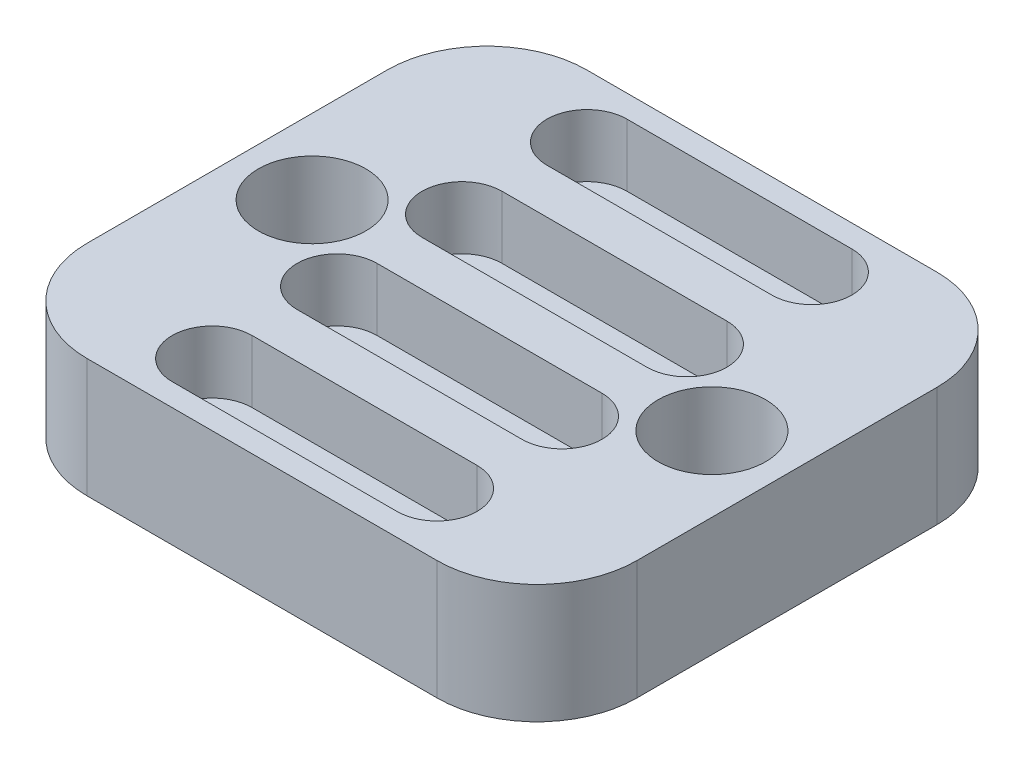
ISO-10303-21;
HEADER;
FILE_DESCRIPTION(('STEP AP214'),'2;1');
FILE_NAME('part.step','',(''),(''),'','','');
FILE_SCHEMA(('AUTOMOTIVE_DESIGN { 1 0 10303 214 1 1 1 1 }'));
ENDSEC;
DATA;
#1=APPLICATION_CONTEXT('core data for automotive mechanical design processes');
#2=APPLICATION_PROTOCOL_DEFINITION('international standard','automotive_design',2000,#1);
#3=PRODUCT_CONTEXT('',#1,'mechanical');
#4=PRODUCT('Part','Part','',(#3));
#5=PRODUCT_RELATED_PRODUCT_CATEGORY('part','',(#4));
#6=PRODUCT_DEFINITION_FORMATION('','',#4);
#7=PRODUCT_DEFINITION_CONTEXT('part definition',#1,'design');
#8=PRODUCT_DEFINITION('design','',#6,#7);
#9=PRODUCT_DEFINITION_SHAPE('','',#8);
#10=(LENGTH_UNIT() NAMED_UNIT(*) SI_UNIT(.MILLI.,.METRE.));
#11=(NAMED_UNIT(*) PLANE_ANGLE_UNIT() SI_UNIT($,.RADIAN.));
#12=(NAMED_UNIT(*) SI_UNIT($,.STERADIAN.) SOLID_ANGLE_UNIT());
#13=UNCERTAINTY_MEASURE_WITH_UNIT(LENGTH_MEASURE(1.E-05),#10,'distance_accuracy_value','');
#14=(GEOMETRIC_REPRESENTATION_CONTEXT(3) GLOBAL_UNCERTAINTY_ASSIGNED_CONTEXT((#13)) GLOBAL_UNIT_ASSIGNED_CONTEXT((#10,
#11,#12)) REPRESENTATION_CONTEXT('',''));
#15=CARTESIAN_POINT('',(0.,0.,0.));
#16=DIRECTION('',(0.,0.,1.));
#17=DIRECTION('',(1.,0.,0.));
#18=AXIS2_PLACEMENT_3D('',#15,#16,#17);
#19=CARTESIAN_POINT('',(4.5,0.,-19.1));
#20=DIRECTION('',(0.,0.,-1.));
#21=DIRECTION('',(-1.,0.,0.));
#22=AXIS2_PLACEMENT_3D('',#19,#20,#21);
#23=PLANE('',#22);
#24=DIRECTION('',(0.,-1.,0.));
#25=VECTOR('',#24,1.);
#26=CARTESIAN_POINT('',(-4.5,0.,-19.1));
#27=LINE('',#26,#25);
#28=CARTESIAN_POINT('',(-4.5,4.7625,-19.1));
#29=VERTEX_POINT('',#28);
#30=CARTESIAN_POINT('',(-4.5,2.2625,-19.1));
#31=VERTEX_POINT('',#30);
#32=EDGE_CURVE('E360',#29,#31,#27,.T.);
#33=ORIENTED_EDGE('',*,*,#32,.T.);
#34=DIRECTION('',(-1.,0.,0.));
#35=VECTOR('',#34,1.);
#36=CARTESIAN_POINT('',(4.5,2.2625,-19.1));
#37=LINE('',#36,#35);
#38=CARTESIAN_POINT('',(4.5,2.2625,-19.1));
#39=VERTEX_POINT('',#38);
#40=EDGE_CURVE('E287',#39,#31,#37,.T.);
#41=ORIENTED_EDGE('',*,*,#40,.F.);
#42=DIRECTION('',(0.,-1.,0.));
#43=VECTOR('',#42,1.);
#44=CARTESIAN_POINT('',(4.5,0.,-19.1));
#45=LINE('',#44,#43);
#46=CARTESIAN_POINT('',(4.5,4.7625,-19.1));
#47=VERTEX_POINT('',#46);
#48=EDGE_CURVE('E239',#47,#39,#45,.T.);
#49=ORIENTED_EDGE('',*,*,#48,.F.);
#50=DIRECTION('',(-1.,0.,0.));
#51=VECTOR('',#50,1.);
#52=CARTESIAN_POINT('',(4.5,4.7625,-19.1));
#53=LINE('',#52,#51);
#54=EDGE_CURVE('E290',#47,#29,#53,.T.);
#55=ORIENTED_EDGE('',*,*,#54,.T.);
#56=EDGE_LOOP('',(#33,#41,#49,#55));
#57=FACE_BOUND('',#56,.T.);
#58=ADVANCED_FACE('F35',(#57),#23,.F.);
#59=CARTESIAN_POINT('',(4.5,2.2625,0.));
#60=DIRECTION('',(0.,1.,0.));
#61=DIRECTION('',(0.,0.,1.));
#62=AXIS2_PLACEMENT_3D('',#59,#60,#61);
#63=PLANE('',#62);
#64=ORIENTED_EDGE('',*,*,#40,.T.);
#65=CARTESIAN_POINT('',(-4.5,2.2625,-17.5));
#66=DIRECTION('',(0.,1.,0.));
#67=DIRECTION('',(0.,0.,1.));
#68=AXIS2_PLACEMENT_3D('',#65,#66,#67);
#69=CIRCLE('',#68,1.6);
#70=CARTESIAN_POINT('',(-4.5,2.2625,-15.9));
#71=VERTEX_POINT('',#70);
#72=EDGE_CURVE('E385',#71,#31,#69,.F.);
#73=ORIENTED_EDGE('',*,*,#72,.F.);
#74=DIRECTION('',(-1.,0.,0.));
#75=VECTOR('',#74,1.);
#76=CARTESIAN_POINT('',(4.5,2.2625,-15.9));
#77=LINE('',#76,#75);
#78=CARTESIAN_POINT('',(4.5,2.2625,-15.9));
#79=VERTEX_POINT('',#78);
#80=EDGE_CURVE('E284',#79,#71,#77,.T.);
#81=ORIENTED_EDGE('',*,*,#80,.F.);
#82=CARTESIAN_POINT('',(4.5,2.2625,-17.5));
#83=DIRECTION('',(0.,1.,0.));
#84=DIRECTION('',(0.,0.,1.));
#85=AXIS2_PLACEMENT_3D('',#82,#83,#84);
#86=CIRCLE('',#85,1.6);
#87=EDGE_CURVE('E402',#39,#79,#86,.F.);
#88=ORIENTED_EDGE('',*,*,#87,.F.);
#89=EDGE_LOOP('',(#64,#73,#81,#88));
#90=FACE_BOUND('',#89,.T.);
#91=ADVANCED_FACE('F392',(#90),#63,.T.);
#92=CARTESIAN_POINT('',(4.5,0.,-15.9));
#93=DIRECTION('',(0.,0.,-1.));
#94=DIRECTION('',(-1.,0.,0.));
#95=AXIS2_PLACEMENT_3D('',#92,#93,#94);
#96=PLANE('',#95);
#97=DIRECTION('',(0.,-1.,0.));
#98=VECTOR('',#97,1.);
#99=CARTESIAN_POINT('',(-4.5,0.,-15.9));
#100=LINE('',#99,#98);
#101=CARTESIAN_POINT('',(-4.5,4.7625,-15.9));
#102=VERTEX_POINT('',#101);
#103=EDGE_CURVE('E229',#102,#71,#100,.T.);
#104=ORIENTED_EDGE('',*,*,#103,.F.);
#105=DIRECTION('',(-1.,0.,0.));
#106=VECTOR('',#105,1.);
#107=CARTESIAN_POINT('',(4.5,4.7625,-15.9));
#108=LINE('',#107,#106);
#109=CARTESIAN_POINT('',(4.5,4.7625,-15.9));
#110=VERTEX_POINT('',#109);
#111=EDGE_CURVE('E281',#110,#102,#108,.T.);
#112=ORIENTED_EDGE('',*,*,#111,.F.);
#113=DIRECTION('',(0.,-1.,0.));
#114=VECTOR('',#113,1.);
#115=CARTESIAN_POINT('',(4.5,0.,-15.9));
#116=LINE('',#115,#114);
#117=EDGE_CURVE('E364',#110,#79,#116,.T.);
#118=ORIENTED_EDGE('',*,*,#117,.T.);
#119=ORIENTED_EDGE('',*,*,#80,.T.);
#120=EDGE_LOOP('',(#104,#112,#118,#119));
#121=FACE_BOUND('',#120,.T.);
#122=ADVANCED_FACE('F397',(#121),#96,.T.);
#123=CARTESIAN_POINT('',(4.5,0.,-14.1));
#124=DIRECTION('',(0.,0.,-1.));
#125=DIRECTION('',(-1.,0.,0.));
#126=AXIS2_PLACEMENT_3D('',#123,#124,#125);
#127=PLANE('',#126);
#128=DIRECTION('',(0.,-1.,0.));
#129=VECTOR('',#128,1.);
#130=CARTESIAN_POINT('',(-4.5,0.,-14.1));
#131=LINE('',#130,#129);
#132=CARTESIAN_POINT('',(-4.5,4.7625,-14.1));
#133=VERTEX_POINT('',#132);
#134=CARTESIAN_POINT('',(-4.5,2.2625,-14.1));
#135=VERTEX_POINT('',#134);
#136=EDGE_CURVE('E203',#133,#135,#131,.T.);
#137=ORIENTED_EDGE('',*,*,#136,.T.);
#138=DIRECTION('',(-1.,0.,0.));
#139=VECTOR('',#138,1.);
#140=CARTESIAN_POINT('',(4.5,2.2625,-14.1));
#141=LINE('',#140,#139);
#142=CARTESIAN_POINT('',(4.5,2.2625,-14.1));
#143=VERTEX_POINT('',#142);
#144=EDGE_CURVE('E276',#143,#135,#141,.T.);
#145=ORIENTED_EDGE('',*,*,#144,.F.);
#146=DIRECTION('',(0.,-1.,0.));
#147=VECTOR('',#146,1.);
#148=CARTESIAN_POINT('',(4.5,0.,-14.1));
#149=LINE('',#148,#147);
#150=CARTESIAN_POINT('',(4.5,4.7625,-14.1));
#151=VERTEX_POINT('',#150);
#152=EDGE_CURVE('E367',#151,#143,#149,.T.);
#153=ORIENTED_EDGE('',*,*,#152,.F.);
#154=DIRECTION('',(-1.,0.,0.));
#155=VECTOR('',#154,1.);
#156=CARTESIAN_POINT('',(4.5,4.7625,-14.1));
#157=LINE('',#156,#155);
#158=EDGE_CURVE('E279',#151,#133,#157,.T.);
#159=ORIENTED_EDGE('',*,*,#158,.T.);
#160=EDGE_LOOP('',(#137,#145,#153,#159));
#161=FACE_BOUND('',#160,.T.);
#162=ADVANCED_FACE('F432',(#161),#127,.F.);
#163=CARTESIAN_POINT('',(4.5,2.2625,0.));
#164=DIRECTION('',(0.,1.,0.));
#165=DIRECTION('',(0.,0.,1.));
#166=AXIS2_PLACEMENT_3D('',#163,#164,#165);
#167=PLANE('',#166);
#168=ORIENTED_EDGE('',*,*,#144,.T.);
#169=CARTESIAN_POINT('',(-4.5,2.2625,-12.5));
#170=DIRECTION('',(0.,1.,0.));
#171=DIRECTION('',(0.,0.,1.));
#172=AXIS2_PLACEMENT_3D('',#169,#170,#171);
#173=CIRCLE('',#172,1.6);
#174=CARTESIAN_POINT('',(-4.5,2.2625,-10.9));
#175=VERTEX_POINT('',#174);
#176=EDGE_CURVE('E207',#175,#135,#173,.F.);
#177=ORIENTED_EDGE('',*,*,#176,.F.);
#178=DIRECTION('',(-1.,0.,0.));
#179=VECTOR('',#178,1.);
#180=CARTESIAN_POINT('',(4.5,2.2625,-10.9));
#181=LINE('',#180,#179);
#182=CARTESIAN_POINT('',(4.5,2.2625,-10.9));
#183=VERTEX_POINT('',#182);
#184=EDGE_CURVE('E218',#183,#175,#181,.T.);
#185=ORIENTED_EDGE('',*,*,#184,.F.);
#186=CARTESIAN_POINT('',(4.5,2.2625,-12.5));
#187=DIRECTION('',(0.,1.,0.));
#188=DIRECTION('',(0.,0.,1.));
#189=AXIS2_PLACEMENT_3D('',#186,#187,#188);
#190=CIRCLE('',#189,1.6);
#191=EDGE_CURVE('E420',#143,#183,#190,.F.);
#192=ORIENTED_EDGE('',*,*,#191,.F.);
#193=EDGE_LOOP('',(#168,#177,#185,#192));
#194=FACE_BOUND('',#193,.T.);
#195=ADVANCED_FACE('F434',(#194),#167,.T.);
#196=CARTESIAN_POINT('',(4.5,0.,-10.9));
#197=DIRECTION('',(0.,0.,-1.));
#198=DIRECTION('',(-1.,0.,0.));
#199=AXIS2_PLACEMENT_3D('',#196,#197,#198);
#200=PLANE('',#199);
#201=DIRECTION('',(0.,-1.,0.));
#202=VECTOR('',#201,1.);
#203=CARTESIAN_POINT('',(-4.5,0.,-10.9));
#204=LINE('',#203,#202);
#205=CARTESIAN_POINT('',(-4.5,4.7625,-10.9));
#206=VERTEX_POINT('',#205);
#207=EDGE_CURVE('E200',#206,#175,#204,.T.);
#208=ORIENTED_EDGE('',*,*,#207,.F.);
#209=DIRECTION('',(-1.,0.,0.));
#210=VECTOR('',#209,1.);
#211=CARTESIAN_POINT('',(4.5,4.7625,-10.9));
#212=LINE('',#211,#210);
#213=CARTESIAN_POINT('',(4.5,4.7625,-10.9));
#214=VERTEX_POINT('',#213);
#215=EDGE_CURVE('E212',#214,#206,#212,.T.);
#216=ORIENTED_EDGE('',*,*,#215,.F.);
#217=DIRECTION('',(0.,-1.,0.));
#218=VECTOR('',#217,1.);
#219=CARTESIAN_POINT('',(4.5,0.,-10.9));
#220=LINE('',#219,#218);
#221=EDGE_CURVE('E369',#214,#183,#220,.T.);
#222=ORIENTED_EDGE('',*,*,#221,.T.);
#223=ORIENTED_EDGE('',*,*,#184,.T.);
#224=EDGE_LOOP('',(#208,#216,#222,#223));
#225=FACE_BOUND('',#224,.T.);
#226=ADVANCED_FACE('F222',(#225),#200,.T.);
#227=CARTESIAN_POINT('',(4.5,0.,-9.1));
#228=DIRECTION('',(0.,0.,-1.));
#229=DIRECTION('',(-1.,0.,0.));
#230=AXIS2_PLACEMENT_3D('',#227,#228,#229);
#231=PLANE('',#230);
#232=DIRECTION('',(0.,-1.,0.));
#233=VECTOR('',#232,1.);
#234=CARTESIAN_POINT('',(-4.5,0.,-9.1));
#235=LINE('',#234,#233);
#236=CARTESIAN_POINT('',(-4.5,4.7625,-9.1));
#237=VERTEX_POINT('',#236);
#238=CARTESIAN_POINT('',(-4.5,2.2625,-9.1));
#239=VERTEX_POINT('',#238);
#240=EDGE_CURVE('E224',#237,#239,#235,.T.);
#241=ORIENTED_EDGE('',*,*,#240,.T.);
#242=DIRECTION('',(-1.,0.,0.));
#243=VECTOR('',#242,1.);
#244=CARTESIAN_POINT('',(4.5,2.2625,-9.1));
#245=LINE('',#244,#243);
#246=CARTESIAN_POINT('',(4.5,2.2625,-9.1));
#247=VERTEX_POINT('',#246);
#248=EDGE_CURVE('E270',#247,#239,#245,.T.);
#249=ORIENTED_EDGE('',*,*,#248,.F.);
#250=DIRECTION('',(0.,-1.,0.));
#251=VECTOR('',#250,1.);
#252=CARTESIAN_POINT('',(4.5,0.,-9.1));
#253=LINE('',#252,#251);
#254=CARTESIAN_POINT('',(4.5,4.7625,-9.1));
#255=VERTEX_POINT('',#254);
#256=EDGE_CURVE('E371',#255,#247,#253,.T.);
#257=ORIENTED_EDGE('',*,*,#256,.F.);
#258=DIRECTION('',(-1.,0.,0.));
#259=VECTOR('',#258,1.);
#260=CARTESIAN_POINT('',(4.5,4.7625,-9.1));
#261=LINE('',#260,#259);
#262=EDGE_CURVE('E219',#255,#237,#261,.T.);
#263=ORIENTED_EDGE('',*,*,#262,.T.);
#264=EDGE_LOOP('',(#241,#249,#257,#263));
#265=FACE_BOUND('',#264,.T.);
#266=ADVANCED_FACE('F534',(#265),#231,.F.);
#267=CARTESIAN_POINT('',(4.5,2.2625,0.));
#268=DIRECTION('',(0.,1.,0.));
#269=DIRECTION('',(0.,0.,1.));
#270=AXIS2_PLACEMENT_3D('',#267,#268,#269);
#271=PLANE('',#270);
#272=ORIENTED_EDGE('',*,*,#248,.T.);
#273=CARTESIAN_POINT('',(-4.5,2.2625,-7.5));
#274=DIRECTION('',(0.,1.,0.));
#275=DIRECTION('',(0.,0.,1.));
#276=AXIS2_PLACEMENT_3D('',#273,#274,#275);
#277=CIRCLE('',#276,1.6);
#278=CARTESIAN_POINT('',(-4.5,2.2625,-5.9));
#279=VERTEX_POINT('',#278);
#280=EDGE_CURVE('E208',#279,#239,#277,.F.);
#281=ORIENTED_EDGE('',*,*,#280,.F.);
#282=DIRECTION('',(-1.,0.,0.));
#283=VECTOR('',#282,1.);
#284=CARTESIAN_POINT('',(4.5,2.2625,-5.9));
#285=LINE('',#284,#283);
#286=CARTESIAN_POINT('',(4.5,2.2625,-5.9));
#287=VERTEX_POINT('',#286);
#288=EDGE_CURVE('E267',#287,#279,#285,.T.);
#289=ORIENTED_EDGE('',*,*,#288,.F.);
#290=CARTESIAN_POINT('',(4.5,2.2625,-7.5));
#291=DIRECTION('',(0.,1.,0.));
#292=DIRECTION('',(0.,0.,1.));
#293=AXIS2_PLACEMENT_3D('',#290,#291,#292);
#294=CIRCLE('',#293,1.6);
#295=EDGE_CURVE('E412',#247,#287,#294,.F.);
#296=ORIENTED_EDGE('',*,*,#295,.F.);
#297=EDGE_LOOP('',(#272,#281,#289,#296));
#298=FACE_BOUND('',#297,.T.);
#299=ADVANCED_FACE('F530',(#298),#271,.T.);
#300=CARTESIAN_POINT('',(4.5,0.,-5.9));
#301=DIRECTION('',(0.,0.,-1.));
#302=DIRECTION('',(0.,1.,0.));
#303=AXIS2_PLACEMENT_3D('',#300,#301,#302);
#304=PLANE('',#303);
#305=DIRECTION('',(0.,-1.,0.));
#306=VECTOR('',#305,1.);
#307=CARTESIAN_POINT('',(-4.5,0.,-5.9));
#308=LINE('',#307,#306);
#309=CARTESIAN_POINT('',(-4.5,4.7625,-5.9));
#310=VERTEX_POINT('',#309);
#311=EDGE_CURVE('E227',#310,#279,#308,.T.);
#312=ORIENTED_EDGE('',*,*,#311,.F.);
#313=DIRECTION('',(-1.,0.,0.));
#314=VECTOR('',#313,1.);
#315=CARTESIAN_POINT('',(4.5,4.7625,-5.9));
#316=LINE('',#315,#314);
#317=CARTESIAN_POINT('',(4.5,4.7625,-5.9));
#318=VERTEX_POINT('',#317);
#319=EDGE_CURVE('E264',#318,#310,#316,.T.);
#320=ORIENTED_EDGE('',*,*,#319,.F.);
#321=DIRECTION('',(0.,-1.,0.));
#322=VECTOR('',#321,1.);
#323=CARTESIAN_POINT('',(4.5,0.,-5.9));
#324=LINE('',#323,#322);
#325=EDGE_CURVE('E373',#318,#287,#324,.T.);
#326=ORIENTED_EDGE('',*,*,#325,.T.);
#327=ORIENTED_EDGE('',*,*,#288,.T.);
#328=EDGE_LOOP('',(#312,#320,#326,#327));
#329=FACE_BOUND('',#328,.T.);
#330=ADVANCED_FACE('F527',(#329),#304,.T.);
#331=CARTESIAN_POINT('',(4.5,0.,-4.1));
#332=DIRECTION('',(0.,0.,-1.));
#333=DIRECTION('',(0.,1.,0.));
#334=AXIS2_PLACEMENT_3D('',#331,#332,#333);
#335=PLANE('',#334);
#336=DIRECTION('',(0.,-1.,0.));
#337=VECTOR('',#336,1.);
#338=CARTESIAN_POINT('',(-4.5,0.,-4.1));
#339=LINE('',#338,#337);
#340=CARTESIAN_POINT('',(-4.5,4.7625,-4.1));
#341=VERTEX_POINT('',#340);
#342=CARTESIAN_POINT('',(-4.5,2.2625,-4.1));
#343=VERTEX_POINT('',#342);
#344=EDGE_CURVE('E234',#341,#343,#339,.T.);
#345=ORIENTED_EDGE('',*,*,#344,.T.);
#346=DIRECTION('',(-1.,0.,0.));
#347=VECTOR('',#346,1.);
#348=CARTESIAN_POINT('',(4.5,2.2625,-4.1));
#349=LINE('',#348,#347);
#350=CARTESIAN_POINT('',(4.5,2.2625,-4.1));
#351=VERTEX_POINT('',#350);
#352=EDGE_CURVE('E258',#351,#343,#349,.T.);
#353=ORIENTED_EDGE('',*,*,#352,.F.);
#354=DIRECTION('',(0.,-1.,0.));
#355=VECTOR('',#354,1.);
#356=CARTESIAN_POINT('',(4.5,0.,-4.1));
#357=LINE('',#356,#355);
#358=CARTESIAN_POINT('',(4.5,4.7625,-4.1));
#359=VERTEX_POINT('',#358);
#360=EDGE_CURVE('E376',#359,#351,#357,.T.);
#361=ORIENTED_EDGE('',*,*,#360,.F.);
#362=DIRECTION('',(-1.,0.,0.));
#363=VECTOR('',#362,1.);
#364=CARTESIAN_POINT('',(4.5,4.7625,-4.1));
#365=LINE('',#364,#363);
#366=EDGE_CURVE('E261',#359,#341,#365,.T.);
#367=ORIENTED_EDGE('',*,*,#366,.T.);
#368=EDGE_LOOP('',(#345,#353,#361,#367));
#369=FACE_BOUND('',#368,.T.);
#370=ADVANCED_FACE('F453',(#369),#335,.F.);
#371=CARTESIAN_POINT('',(4.5,2.2625,0.));
#372=DIRECTION('',(0.,1.,0.));
#373=DIRECTION('',(0.,0.,1.));
#374=AXIS2_PLACEMENT_3D('',#371,#372,#373);
#375=PLANE('',#374);
#376=ORIENTED_EDGE('',*,*,#352,.T.);
#377=CARTESIAN_POINT('',(-4.5,2.2625,-2.5));
#378=DIRECTION('',(0.,1.,0.));
#379=DIRECTION('',(0.,0.,1.));
#380=AXIS2_PLACEMENT_3D('',#377,#378,#379);
#381=CIRCLE('',#380,1.6);
#382=CARTESIAN_POINT('',(-4.5,2.2625,-0.9));
#383=VERTEX_POINT('',#382);
#384=EDGE_CURVE('E439',#383,#343,#381,.F.);
#385=ORIENTED_EDGE('',*,*,#384,.F.);
#386=DIRECTION('',(-1.,0.,0.));
#387=VECTOR('',#386,1.);
#388=CARTESIAN_POINT('',(4.5,2.2625,-0.9));
#389=LINE('',#388,#387);
#390=CARTESIAN_POINT('',(4.5,2.2625,-0.9));
#391=VERTEX_POINT('',#390);
#392=EDGE_CURVE('E255',#391,#383,#389,.T.);
#393=ORIENTED_EDGE('',*,*,#392,.F.);
#394=CARTESIAN_POINT('',(4.5,2.2625,-2.5));
#395=DIRECTION('',(0.,1.,0.));
#396=DIRECTION('',(0.,0.,1.));
#397=AXIS2_PLACEMENT_3D('',#394,#395,#396);
#398=CIRCLE('',#397,1.6);
#399=EDGE_CURVE('E350',#351,#391,#398,.F.);
#400=ORIENTED_EDGE('',*,*,#399,.F.);
#401=EDGE_LOOP('',(#376,#385,#393,#400));
#402=FACE_BOUND('',#401,.T.);
#403=ADVANCED_FACE('F449',(#402),#375,.T.);
#404=CARTESIAN_POINT('',(4.5,0.,-0.900000000000001));
#405=DIRECTION('',(0.,0.,-1.));
#406=DIRECTION('',(0.,1.,0.));
#407=AXIS2_PLACEMENT_3D('',#404,#405,#406);
#408=PLANE('',#407);
#409=DIRECTION('',(0.,-1.,0.));
#410=VECTOR('',#409,1.);
#411=CARTESIAN_POINT('',(-4.5,0.,-0.900000000000001));
#412=LINE('',#411,#410);
#413=CARTESIAN_POINT('',(-4.5,4.7625,-0.9));
#414=VERTEX_POINT('',#413);
#415=EDGE_CURVE('E237',#414,#383,#412,.T.);
#416=ORIENTED_EDGE('',*,*,#415,.F.);
#417=DIRECTION('',(-1.,0.,0.));
#418=VECTOR('',#417,1.);
#419=CARTESIAN_POINT('',(4.5,4.7625,-0.9));
#420=LINE('',#419,#418);
#421=CARTESIAN_POINT('',(4.5,4.7625,-0.9));
#422=VERTEX_POINT('',#421);
#423=EDGE_CURVE('E252',#422,#414,#420,.T.);
#424=ORIENTED_EDGE('',*,*,#423,.F.);
#425=DIRECTION('',(0.,-1.,0.));
#426=VECTOR('',#425,1.);
#427=CARTESIAN_POINT('',(4.5,0.,-0.900000000000001));
#428=LINE('',#427,#426);
#429=EDGE_CURVE('E244',#422,#391,#428,.T.);
#430=ORIENTED_EDGE('',*,*,#429,.T.);
#431=ORIENTED_EDGE('',*,*,#392,.T.);
#432=EDGE_LOOP('',(#416,#424,#430,#431));
#433=FACE_BOUND('',#432,.T.);
#434=ADVANCED_FACE('F447',(#433),#408,.T.);
#435=CARTESIAN_POINT('',(4.5,4.7625,0.));
#436=DIRECTION('',(0.,1.,0.));
#437=DIRECTION('',(0.,0.,1.));
#438=AXIS2_PLACEMENT_3D('',#435,#436,#437);
#439=PLANE('',#438);
#440=CARTESIAN_POINT('',(4.5,4.7625,-7.5));
#441=DIRECTION('',(0.,1.,0.));
#442=DIRECTION('',(0.,0.,1.));
#443=AXIS2_PLACEMENT_3D('',#440,#441,#442);
#444=CIRCLE('',#443,1.6);
#445=EDGE_CURVE('E415',#318,#255,#444,.T.);
#446=ORIENTED_EDGE('',*,*,#445,.F.);
#447=ORIENTED_EDGE('',*,*,#319,.T.);
#448=CARTESIAN_POINT('',(-4.5,4.7625,-7.5));
#449=DIRECTION('',(0.,1.,0.));
#450=DIRECTION('',(0.,0.,-1.));
#451=AXIS2_PLACEMENT_3D('',#448,#449,#450);
#452=CIRCLE('',#451,1.6);
#453=EDGE_CURVE('E438',#237,#310,#452,.T.);
#454=ORIENTED_EDGE('',*,*,#453,.F.);
#455=ORIENTED_EDGE('',*,*,#262,.F.);
#456=EDGE_LOOP('',(#446,#447,#454,#455));
#457=FACE_BOUND('',#456,.T.);
#458=CARTESIAN_POINT('',(4.5,4.7625,-12.5));
#459=DIRECTION('',(0.,1.,0.));
#460=DIRECTION('',(0.,0.,1.));
#461=AXIS2_PLACEMENT_3D('',#458,#459,#460);
#462=CIRCLE('',#461,1.6);
#463=EDGE_CURVE('E215',#214,#151,#462,.T.);
#464=ORIENTED_EDGE('',*,*,#463,.F.);
#465=ORIENTED_EDGE('',*,*,#215,.T.);
#466=CARTESIAN_POINT('',(-4.5,4.7625,-12.5));
#467=DIRECTION('',(0.,1.,0.));
#468=DIRECTION('',(0.,0.,-1.));
#469=AXIS2_PLACEMENT_3D('',#466,#467,#468);
#470=CIRCLE('',#469,1.6);
#471=EDGE_CURVE('E196',#133,#206,#470,.T.);
#472=ORIENTED_EDGE('',*,*,#471,.F.);
#473=ORIENTED_EDGE('',*,*,#158,.F.);
#474=EDGE_LOOP('',(#464,#465,#472,#473));
#475=FACE_BOUND('',#474,.T.);
#476=CARTESIAN_POINT('',(4.5,4.7625,-17.5));
#477=DIRECTION('',(0.,1.,0.));
#478=DIRECTION('',(0.,0.,1.));
#479=AXIS2_PLACEMENT_3D('',#476,#477,#478);
#480=CIRCLE('',#479,1.6);
#481=EDGE_CURVE('E395',#110,#47,#480,.T.);
#482=ORIENTED_EDGE('',*,*,#481,.F.);
#483=ORIENTED_EDGE('',*,*,#111,.T.);
#484=CARTESIAN_POINT('',(-4.5,4.7625,-17.5));
#485=DIRECTION('',(0.,1.,0.));
#486=DIRECTION('',(0.,0.,-1.));
#487=AXIS2_PLACEMENT_3D('',#484,#485,#486);
#488=CIRCLE('',#487,1.6);
#489=EDGE_CURVE('E387',#29,#102,#488,.T.);
#490=ORIENTED_EDGE('',*,*,#489,.F.);
#491=ORIENTED_EDGE('',*,*,#54,.F.);
#492=EDGE_LOOP('',(#482,#483,#490,#491));
#493=FACE_BOUND('',#492,.T.);
#494=CARTESIAN_POINT('',(-4.5,4.7625,-2.5));
#495=DIRECTION('',(0.,1.,0.));
#496=DIRECTION('',(0.,0.,-1.));
#497=AXIS2_PLACEMENT_3D('',#494,#495,#496);
#498=CIRCLE('',#497,1.6);
#499=EDGE_CURVE('E423',#341,#414,#498,.T.);
#500=ORIENTED_EDGE('',*,*,#499,.F.);
#501=ORIENTED_EDGE('',*,*,#366,.F.);
#502=CARTESIAN_POINT('',(4.5,4.7625,-2.5));
#503=DIRECTION('',(0.,1.,0.));
#504=DIRECTION('',(0.,0.,1.));
#505=AXIS2_PLACEMENT_3D('',#502,#503,#504);
#506=CIRCLE('',#505,1.6);
#507=EDGE_CURVE('E346',#422,#359,#506,.T.);
#508=ORIENTED_EDGE('',*,*,#507,.F.);
#509=ORIENTED_EDGE('',*,*,#423,.T.);
#510=EDGE_LOOP('',(#500,#501,#508,#509));
#511=FACE_BOUND('',#510,.T.);
#512=DIRECTION('',(0.,0.,1.));
#513=VECTOR('',#512,1.);
#514=CARTESIAN_POINT('',(11.,4.7625,0.));
#515=LINE('',#514,#513);
#516=CARTESIAN_POINT('',(11.,4.7625,-16.));
#517=VERTEX_POINT('',#516);
#518=CARTESIAN_POINT('',(11.,4.7625,-4.));
#519=VERTEX_POINT('',#518);
#520=EDGE_CURVE('E341',#517,#519,#515,.T.);
#521=ORIENTED_EDGE('',*,*,#520,.F.);
#522=CARTESIAN_POINT('',(7.,4.7625,-16.));
#523=DIRECTION('',(0.,1.,0.));
#524=DIRECTION('',(0.,0.,1.));
#525=AXIS2_PLACEMENT_3D('',#522,#523,#524);
#526=CIRCLE('',#525,4.);
#527=CARTESIAN_POINT('',(7.,4.7625,-20.));
#528=VERTEX_POINT('',#527);
#529=EDGE_CURVE('E316',#517,#528,#526,.T.);
#530=ORIENTED_EDGE('',*,*,#529,.T.);
#531=DIRECTION('',(-1.,0.,0.));
#532=VECTOR('',#531,1.);
#533=CARTESIAN_POINT('',(4.5,4.7625,-20.));
#534=LINE('',#533,#532);
#535=CARTESIAN_POINT('',(-7.,4.7625,-20.));
#536=VERTEX_POINT('',#535);
#537=EDGE_CURVE('E240',#528,#536,#534,.T.);
#538=ORIENTED_EDGE('',*,*,#537,.T.);
#539=CARTESIAN_POINT('',(-7.,4.7625,-16.));
#540=DIRECTION('',(0.,1.,0.));
#541=DIRECTION('',(0.,0.,1.));
#542=AXIS2_PLACEMENT_3D('',#539,#540,#541);
#543=CIRCLE('',#542,4.);
#544=CARTESIAN_POINT('',(-11.,4.7625,-16.));
#545=VERTEX_POINT('',#544);
#546=EDGE_CURVE('E311',#536,#545,#543,.T.);
#547=ORIENTED_EDGE('',*,*,#546,.T.);
#548=DIRECTION('',(0.,0.,-1.));
#549=VECTOR('',#548,1.);
#550=CARTESIAN_POINT('',(-11.,4.7625,0.));
#551=LINE('',#550,#549);
#552=CARTESIAN_POINT('',(-11.,4.7625,-4.));
#553=VERTEX_POINT('',#552);
#554=EDGE_CURVE('E330',#553,#545,#551,.T.);
#555=ORIENTED_EDGE('',*,*,#554,.F.);
#556=CARTESIAN_POINT('',(-7.,4.7625,-4.));
#557=DIRECTION('',(0.,1.,0.));
#558=DIRECTION('',(0.,0.,1.));
#559=AXIS2_PLACEMENT_3D('',#556,#557,#558);
#560=CIRCLE('',#559,4.);
#561=CARTESIAN_POINT('',(-7.,4.7625,0.));
#562=VERTEX_POINT('',#561);
#563=EDGE_CURVE('E50',#553,#562,#560,.T.);
#564=ORIENTED_EDGE('',*,*,#563,.T.);
#565=DIRECTION('',(-1.,0.,0.));
#566=VECTOR('',#565,1.);
#567=CARTESIAN_POINT('',(4.5,4.7625,0.));
#568=LINE('',#567,#566);
#569=CARTESIAN_POINT('',(7.,4.7625,0.));
#570=VERTEX_POINT('',#569);
#571=EDGE_CURVE('E250',#570,#562,#568,.T.);
#572=ORIENTED_EDGE('',*,*,#571,.F.);
#573=CARTESIAN_POINT('',(7.,4.7625,-4.));
#574=DIRECTION('',(0.,1.,0.));
#575=DIRECTION('',(0.,0.,1.));
#576=AXIS2_PLACEMENT_3D('',#573,#574,#575);
#577=CIRCLE('',#576,4.);
#578=EDGE_CURVE('E314',#570,#519,#577,.T.);
#579=ORIENTED_EDGE('',*,*,#578,.T.);
#580=EDGE_LOOP('',(#521,#530,#538,#547,#555,#564,#572,#579));
#581=FACE_BOUND('',#580,.T.);
#582=CARTESIAN_POINT('',(8.,4.7625,-10.));
#583=DIRECTION('',(0.,1.,0.));
#584=DIRECTION('',(0.,0.,1.));
#585=AXIS2_PLACEMENT_3D('',#582,#583,#584);
#586=CIRCLE('',#585,2.15265);
#587=CARTESIAN_POINT('',(8.,4.7625,-12.15265));
#588=VERTEX_POINT('',#587);
#589=EDGE_CURVE('E354',#588,#588,#586,.F.);
#590=ORIENTED_EDGE('',*,*,#589,.T.);
#591=EDGE_LOOP('',(#590));
#592=FACE_BOUND('',#591,.T.);
#593=CARTESIAN_POINT('',(-8.,4.7625,-10.));
#594=DIRECTION('',(0.,1.,0.));
#595=DIRECTION('',(0.,0.,1.));
#596=AXIS2_PLACEMENT_3D('',#593,#594,#595);
#597=CIRCLE('',#596,2.15265);
#598=CARTESIAN_POINT('',(-8.,4.7625,-12.15265));
#599=VERTEX_POINT('',#598);
#600=EDGE_CURVE('E337',#599,#599,#597,.F.);
#601=ORIENTED_EDGE('',*,*,#600,.T.);
#602=EDGE_LOOP('',(#601));
#603=FACE_BOUND('',#602,.T.);
#604=ADVANCED_FACE('F213',(#457,#475,#493,#511,#581,#592,#603),#439,.T.);
#605=CARTESIAN_POINT('',(4.5,0.,0.));
#606=DIRECTION('',(0.,0.,1.));
#607=DIRECTION('',(1.,0.,0.));
#608=AXIS2_PLACEMENT_3D('',#605,#606,#607);
#609=PLANE('',#608);
#610=DIRECTION('',(-1.,0.,0.));
#611=VECTOR('',#610,1.);
#612=CARTESIAN_POINT('',(4.5,0.,0.));
#613=LINE('',#612,#611);
#614=CARTESIAN_POINT('',(7.,0.,0.));
#615=VERTEX_POINT('',#614);
#616=CARTESIAN_POINT('',(-7.,0.,0.));
#617=VERTEX_POINT('',#616);
#618=EDGE_CURVE('E247',#615,#617,#613,.T.);
#619=ORIENTED_EDGE('',*,*,#618,.F.);
#620=DIRECTION('',(0.,-1.,0.));
#621=VECTOR('',#620,1.);
#622=CARTESIAN_POINT('',(7.,0.,0.));
#623=LINE('',#622,#621);
#624=EDGE_CURVE('E57',#615,#570,#623,.F.);
#625=ORIENTED_EDGE('',*,*,#624,.T.);
#626=ORIENTED_EDGE('',*,*,#571,.T.);
#627=DIRECTION('',(0.,-1.,0.));
#628=VECTOR('',#627,1.);
#629=CARTESIAN_POINT('',(-7.,0.,0.));
#630=LINE('',#629,#628);
#631=EDGE_CURVE('E318',#562,#617,#630,.T.);
#632=ORIENTED_EDGE('',*,*,#631,.T.);
#633=EDGE_LOOP('',(#619,#625,#626,#632));
#634=FACE_BOUND('',#633,.T.);
#635=ADVANCED_FACE('F490',(#634),#609,.T.);
#636=CARTESIAN_POINT('',(4.5,0.,0.));
#637=DIRECTION('',(0.,1.,0.));
#638=DIRECTION('',(0.,0.,1.));
#639=AXIS2_PLACEMENT_3D('',#636,#637,#638);
#640=PLANE('',#639);
#641=DIRECTION('',(-1.,0.,0.));
#642=VECTOR('',#641,1.);
#643=CARTESIAN_POINT('',(4.5,0.,-20.));
#644=LINE('',#643,#642);
#645=CARTESIAN_POINT('',(7.,0.,-20.));
#646=VERTEX_POINT('',#645);
#647=CARTESIAN_POINT('',(-7.,0.,-20.));
#648=VERTEX_POINT('',#647);
#649=EDGE_CURVE('E243',#646,#648,#644,.T.);
#650=ORIENTED_EDGE('',*,*,#649,.F.);
#651=CARTESIAN_POINT('',(7.,0.,-16.));
#652=DIRECTION('',(0.,1.,0.));
#653=DIRECTION('',(0.,0.,1.));
#654=AXIS2_PLACEMENT_3D('',#651,#652,#653);
#655=CIRCLE('',#654,4.);
#656=CARTESIAN_POINT('',(11.,0.,-16.));
#657=VERTEX_POINT('',#656);
#658=EDGE_CURVE('E304',#646,#657,#655,.F.);
#659=ORIENTED_EDGE('',*,*,#658,.T.);
#660=DIRECTION('',(0.,0.,1.));
#661=VECTOR('',#660,1.);
#662=CARTESIAN_POINT('',(11.,0.,0.));
#663=LINE('',#662,#661);
#664=CARTESIAN_POINT('',(11.,0.,-4.));
#665=VERTEX_POINT('',#664);
#666=EDGE_CURVE('E351',#657,#665,#663,.T.);
#667=ORIENTED_EDGE('',*,*,#666,.T.);
#668=CARTESIAN_POINT('',(7.,0.,-4.));
#669=DIRECTION('',(0.,1.,0.));
#670=DIRECTION('',(0.,0.,1.));
#671=AXIS2_PLACEMENT_3D('',#668,#669,#670);
#672=CIRCLE('',#671,4.);
#673=EDGE_CURVE('E302',#665,#615,#672,.F.);
#674=ORIENTED_EDGE('',*,*,#673,.T.);
#675=ORIENTED_EDGE('',*,*,#618,.T.);
#676=CARTESIAN_POINT('',(-7.,0.,-4.));
#677=DIRECTION('',(0.,1.,0.));
#678=DIRECTION('',(0.,0.,1.));
#679=AXIS2_PLACEMENT_3D('',#676,#677,#678);
#680=CIRCLE('',#679,4.);
#681=CARTESIAN_POINT('',(-11.,0.,-4.));
#682=VERTEX_POINT('',#681);
#683=EDGE_CURVE('E300',#617,#682,#680,.F.);
#684=ORIENTED_EDGE('',*,*,#683,.T.);
#685=DIRECTION('',(0.,0.,-1.));
#686=VECTOR('',#685,1.);
#687=CARTESIAN_POINT('',(-11.,0.,0.));
#688=LINE('',#687,#686);
#689=CARTESIAN_POINT('',(-11.,0.,-16.));
#690=VERTEX_POINT('',#689);
#691=EDGE_CURVE('E328',#682,#690,#688,.T.);
#692=ORIENTED_EDGE('',*,*,#691,.T.);
#693=CARTESIAN_POINT('',(-7.,0.,-16.));
#694=DIRECTION('',(0.,1.,0.));
#695=DIRECTION('',(0.,0.,1.));
#696=AXIS2_PLACEMENT_3D('',#693,#694,#695);
#697=CIRCLE('',#696,4.);
#698=EDGE_CURVE('E298',#690,#648,#697,.F.);
#699=ORIENTED_EDGE('',*,*,#698,.T.);
#700=EDGE_LOOP('',(#650,#659,#667,#674,#675,#684,#692,#699));
#701=FACE_BOUND('',#700,.T.);
#702=CARTESIAN_POINT('',(8.,0.,-10.));
#703=DIRECTION('',(0.,-1.,0.));
#704=DIRECTION('',(0.,0.,-1.));
#705=AXIS2_PLACEMENT_3D('',#702,#703,#704);
#706=CIRCLE('',#705,2.15265);
#707=CARTESIAN_POINT('',(8.,0.,-12.15265));
#708=VERTEX_POINT('',#707);
#709=EDGE_CURVE('E355',#708,#708,#706,.T.);
#710=ORIENTED_EDGE('',*,*,#709,.F.);
#711=EDGE_LOOP('',(#710));
#712=FACE_BOUND('',#711,.T.);
#713=CARTESIAN_POINT('',(-8.,0.,-10.));
#714=DIRECTION('',(0.,-1.,0.));
#715=DIRECTION('',(0.,0.,1.));
#716=AXIS2_PLACEMENT_3D('',#713,#714,#715);
#717=CIRCLE('',#716,2.15265);
#718=CARTESIAN_POINT('',(-8.,0.,-12.15265));
#719=VERTEX_POINT('',#718);
#720=EDGE_CURVE('E338',#719,#719,#717,.T.);
#721=ORIENTED_EDGE('',*,*,#720,.F.);
#722=EDGE_LOOP('',(#721));
#723=FACE_BOUND('',#722,.T.);
#724=ADVANCED_FACE('F335',(#701,#712,#723),#640,.F.);
#725=CARTESIAN_POINT('',(4.5,0.,-20.));
#726=DIRECTION('',(0.,0.,1.));
#727=DIRECTION('',(1.,0.,0.));
#728=AXIS2_PLACEMENT_3D('',#725,#726,#727);
#729=PLANE('',#728);
#730=ORIENTED_EDGE('',*,*,#537,.F.);
#731=DIRECTION('',(0.,-1.,0.));
#732=VECTOR('',#731,1.);
#733=CARTESIAN_POINT('',(7.,0.,-20.));
#734=LINE('',#733,#732);
#735=EDGE_CURVE('E295',#528,#646,#734,.T.);
#736=ORIENTED_EDGE('',*,*,#735,.T.);
#737=ORIENTED_EDGE('',*,*,#649,.T.);
#738=DIRECTION('',(0.,-1.,0.));
#739=VECTOR('',#738,1.);
#740=CARTESIAN_POINT('',(-7.,4.7625,-20.));
#741=LINE('',#740,#739);
#742=EDGE_CURVE('E293',#648,#536,#741,.F.);
#743=ORIENTED_EDGE('',*,*,#742,.T.);
#744=EDGE_LOOP('',(#730,#736,#737,#743));
#745=FACE_BOUND('',#744,.T.);
#746=ADVANCED_FACE('F503',(#745),#729,.F.);
#747=CARTESIAN_POINT('',(11.,25.7922408448131,0.));
#748=DIRECTION('',(1.,0.,0.));
#749=DIRECTION('',(0.,0.,-1.));
#750=AXIS2_PLACEMENT_3D('',#747,#748,#749);
#751=PLANE('',#750);
#752=ORIENTED_EDGE('',*,*,#666,.F.);
#753=DIRECTION('',(0.,-1.,0.));
#754=VECTOR('',#753,1.);
#755=CARTESIAN_POINT('',(11.,4.76250000000001,-16.));
#756=LINE('',#755,#754);
#757=EDGE_CURVE('E309',#657,#517,#756,.F.);
#758=ORIENTED_EDGE('',*,*,#757,.T.);
#759=ORIENTED_EDGE('',*,*,#520,.T.);
#760=DIRECTION('',(0.,-1.,0.));
#761=VECTOR('',#760,1.);
#762=CARTESIAN_POINT('',(11.,25.7922408448131,-4.));
#763=LINE('',#762,#761);
#764=EDGE_CURVE('E306',#519,#665,#763,.T.);
#765=ORIENTED_EDGE('',*,*,#764,.T.);
#766=EDGE_LOOP('',(#752,#758,#759,#765));
#767=FACE_BOUND('',#766,.T.);
#768=ADVANCED_FACE('F495',(#767),#751,.T.);
#769=CARTESIAN_POINT('',(8.,25.7922408448131,-10.));
#770=DIRECTION('',(0.,-1.,0.));
#771=DIRECTION('',(0.,0.,-1.));
#772=AXIS2_PLACEMENT_3D('',#769,#770,#771);
#773=CYLINDRICAL_SURFACE('',#772,2.15265);
#774=CARTESIAN_POINT('',(8.,0.,-12.15265));
#775=CARTESIAN_POINT('',(8.,0.049609375,-12.15265));
#776=CARTESIAN_POINT('',(8.,0.09921875,-12.15265));
#777=CARTESIAN_POINT('',(8.,0.1984375,-12.15265));
#778=CARTESIAN_POINT('',(8.,0.248046875,-12.15265));
#779=CARTESIAN_POINT('',(8.,0.347265625,-12.15265));
#780=CARTESIAN_POINT('',(8.,0.396875,-12.15265));
#781=CARTESIAN_POINT('',(8.,0.49609375,-12.15265));
#782=CARTESIAN_POINT('',(8.,0.545703125,-12.15265));
#783=CARTESIAN_POINT('',(8.,0.644921875,-12.15265));
#784=CARTESIAN_POINT('',(8.,0.69453125,-12.15265));
#785=CARTESIAN_POINT('',(8.,0.793750000000001,-12.15265));
#786=CARTESIAN_POINT('',(8.,0.843359375,-12.15265));
#787=CARTESIAN_POINT('',(8.,0.942578125000001,-12.15265));
#788=CARTESIAN_POINT('',(8.,0.992187500000001,-12.15265));
#789=CARTESIAN_POINT('',(8.,1.09140625,-12.15265));
#790=CARTESIAN_POINT('',(8.,1.141015625,-12.15265));
#791=CARTESIAN_POINT('',(8.,1.240234375,-12.15265));
#792=CARTESIAN_POINT('',(8.,1.28984375,-12.15265));
#793=CARTESIAN_POINT('',(8.,1.3890625,-12.15265));
#794=CARTESIAN_POINT('',(8.,1.438671875,-12.15265));
#795=CARTESIAN_POINT('',(8.,1.537890625,-12.15265));
#796=CARTESIAN_POINT('',(8.,1.5875,-12.15265));
#797=CARTESIAN_POINT('',(8.,1.68671875,-12.15265));
#798=CARTESIAN_POINT('',(8.,1.736328125,-12.15265));
#799=CARTESIAN_POINT('',(8.,1.835546875,-12.15265));
#800=CARTESIAN_POINT('',(8.,1.88515625,-12.15265));
#801=CARTESIAN_POINT('',(8.,1.984375,-12.15265));
#802=CARTESIAN_POINT('',(8.,2.033984375,-12.15265));
#803=CARTESIAN_POINT('',(8.,2.133203125,-12.15265));
#804=CARTESIAN_POINT('',(8.,2.1828125,-12.15265));
#805=CARTESIAN_POINT('',(8.,2.28203125,-12.15265));
#806=CARTESIAN_POINT('',(8.,2.331640625,-12.15265));
#807=CARTESIAN_POINT('',(8.,2.430859375,-12.15265));
#808=CARTESIAN_POINT('',(8.,2.48046875,-12.15265));
#809=CARTESIAN_POINT('',(8.,2.5796875,-12.15265));
#810=CARTESIAN_POINT('',(8.,2.629296875,-12.15265));
#811=CARTESIAN_POINT('',(8.,2.728515625,-12.15265));
#812=CARTESIAN_POINT('',(8.,2.778125,-12.15265));
#813=CARTESIAN_POINT('',(8.,2.87734375,-12.15265));
#814=CARTESIAN_POINT('',(8.,2.926953125,-12.15265));
#815=CARTESIAN_POINT('',(8.,3.026171875,-12.15265));
#816=CARTESIAN_POINT('',(8.,3.07578125,-12.15265));
#817=CARTESIAN_POINT('',(8.,3.175,-12.15265));
#818=CARTESIAN_POINT('',(8.,3.224609375,-12.15265));
#819=CARTESIAN_POINT('',(8.,3.323828125,-12.15265));
#820=CARTESIAN_POINT('',(8.,3.3734375,-12.15265));
#821=CARTESIAN_POINT('',(8.,3.47265625,-12.15265));
#822=CARTESIAN_POINT('',(8.,3.52226562499999,-12.15265));
#823=CARTESIAN_POINT('',(8.,3.621484375,-12.15265));
#824=CARTESIAN_POINT('',(8.,3.67109374999999,-12.15265));
#825=CARTESIAN_POINT('',(8.,3.7703125,-12.15265));
#826=CARTESIAN_POINT('',(8.,3.819921875,-12.15265));
#827=CARTESIAN_POINT('',(8.,3.91914062499999,-12.15265));
#828=CARTESIAN_POINT('',(8.,3.96875,-12.15265));
#829=CARTESIAN_POINT('',(8.,4.06796875,-12.15265));
#830=CARTESIAN_POINT('',(8.,4.117578125,-12.15265));
#831=CARTESIAN_POINT('',(8.,4.216796875,-12.15265));
#832=CARTESIAN_POINT('',(8.,4.26640625,-12.15265));
#833=CARTESIAN_POINT('',(8.,4.365625,-12.15265));
#834=CARTESIAN_POINT('',(8.,4.415234375,-12.15265));
#835=CARTESIAN_POINT('',(8.,4.514453125,-12.15265));
#836=CARTESIAN_POINT('',(8.,4.5640625,-12.15265));
#837=CARTESIAN_POINT('',(8.,4.66328125,-12.15265));
#838=CARTESIAN_POINT('',(8.,4.712890625,-12.15265));
#839=CARTESIAN_POINT('',(8.,4.7625,-12.15265));
#840=B_SPLINE_CURVE_WITH_KNOTS('',3,(#774,#775,#776,#777,#778,#779,#780,#781,#782,#783,#784,
#785,#786,#787,#788,#789,#790,#791,#792,#793,#794,#795,#796,#797,#798,#799,#800,#801,#802,#803,
#804,#805,#806,#807,#808,#809,#810,#811,#812,#813,#814,#815,#816,#817,#818,#819,#820,#821,#822,
#823,#824,#825,#826,#827,#828,#829,#830,#831,#832,#833,#834,#835,#836,#837,#838,#839),
.UNSPECIFIED.,.F.,.F.,(4,2,2,2,2,2,2,2,2,2,2,2,2,2,2,2,2,2,2,2,2,2,2,2,2,2,2,2,2,2,2,2,4),(0.,
0.148828125,0.29765625,0.446484375,0.5953125,0.744140625,0.892968750000001,1.041796875,1.190625,
1.339453125,1.48828125,1.637109375,1.7859375,1.934765625,2.08359375,2.232421875,2.38125,
2.530078125,2.67890625,2.827734375,2.9765625,3.125390625,3.27421875,3.42304687499999,3.571875,
3.720703125,3.86953125,4.018359375,4.1671875,4.316015625,4.46484375,4.613671875,4.7625),.UNSPECIFIED.);
#841=EDGE_CURVE('BSEAM511',#708,#588,#840,.T.);
#842=ORIENTED_EDGE('',*,*,#709,.T.);
#843=ORIENTED_EDGE('',*,*,#589,.F.);
#844=ORIENTED_EDGE('',*,*,#841,.T.);
#845=ORIENTED_EDGE('',*,*,#841,.F.);
#846=EDGE_LOOP('',(#842,#844,#843,#845));
#847=FACE_BOUND('',#846,.T.);
#848=ADVANCED_FACE('F511',(#847),#773,.F.);
#849=CARTESIAN_POINT('',(-11.,25.7922408448131,0.));
#850=DIRECTION('',(-1.,0.,0.));
#851=DIRECTION('',(0.,0.,1.));
#852=AXIS2_PLACEMENT_3D('',#849,#850,#851);
#853=PLANE('',#852);
#854=ORIENTED_EDGE('',*,*,#691,.F.);
#855=DIRECTION('',(0.,-1.,0.));
#856=VECTOR('',#855,1.);
#857=CARTESIAN_POINT('',(-11.,25.7922408448131,-4.));
#858=LINE('',#857,#856);
#859=EDGE_CURVE('E11',#682,#553,#858,.F.);
#860=ORIENTED_EDGE('',*,*,#859,.T.);
#861=ORIENTED_EDGE('',*,*,#554,.T.);
#862=DIRECTION('',(0.,-1.,0.));
#863=VECTOR('',#862,1.);
#864=CARTESIAN_POINT('',(-11.,0.,-16.));
#865=LINE('',#864,#863);
#866=EDGE_CURVE('E43',#545,#690,#865,.T.);
#867=ORIENTED_EDGE('',*,*,#866,.T.);
#868=EDGE_LOOP('',(#854,#860,#861,#867));
#869=FACE_BOUND('',#868,.T.);
#870=ADVANCED_FACE('F327',(#869),#853,.T.);
#871=CARTESIAN_POINT('',(-8.,25.7922408448131,-10.));
#872=DIRECTION('',(0.,-1.,0.));
#873=DIRECTION('',(0.,0.,-1.));
#874=AXIS2_PLACEMENT_3D('',#871,#872,#873);
#875=CYLINDRICAL_SURFACE('',#874,2.15265);
#876=CARTESIAN_POINT('',(-8.,0.,-12.15265));
#877=CARTESIAN_POINT('',(-8.,0.049609375,-12.15265));
#878=CARTESIAN_POINT('',(-8.,0.09921875,-12.15265));
#879=CARTESIAN_POINT('',(-8.,0.1984375,-12.15265));
#880=CARTESIAN_POINT('',(-8.,0.248046875,-12.15265));
#881=CARTESIAN_POINT('',(-8.,0.347265625,-12.15265));
#882=CARTESIAN_POINT('',(-8.,0.396875,-12.15265));
#883=CARTESIAN_POINT('',(-8.,0.49609375,-12.15265));
#884=CARTESIAN_POINT('',(-8.,0.545703125,-12.15265));
#885=CARTESIAN_POINT('',(-8.,0.644921875,-12.15265));
#886=CARTESIAN_POINT('',(-8.,0.69453125,-12.15265));
#887=CARTESIAN_POINT('',(-8.,0.793750000000001,-12.15265));
#888=CARTESIAN_POINT('',(-8.,0.843359375,-12.15265));
#889=CARTESIAN_POINT('',(-8.,0.942578125000001,-12.15265));
#890=CARTESIAN_POINT('',(-8.,0.992187500000001,-12.15265));
#891=CARTESIAN_POINT('',(-8.,1.09140625,-12.15265));
#892=CARTESIAN_POINT('',(-8.,1.141015625,-12.15265));
#893=CARTESIAN_POINT('',(-8.,1.240234375,-12.15265));
#894=CARTESIAN_POINT('',(-8.,1.28984375,-12.15265));
#895=CARTESIAN_POINT('',(-8.,1.3890625,-12.15265));
#896=CARTESIAN_POINT('',(-8.,1.438671875,-12.15265));
#897=CARTESIAN_POINT('',(-8.,1.537890625,-12.15265));
#898=CARTESIAN_POINT('',(-8.,1.5875,-12.15265));
#899=CARTESIAN_POINT('',(-8.,1.68671875,-12.15265));
#900=CARTESIAN_POINT('',(-8.,1.736328125,-12.15265));
#901=CARTESIAN_POINT('',(-8.,1.835546875,-12.15265));
#902=CARTESIAN_POINT('',(-8.,1.88515625,-12.15265));
#903=CARTESIAN_POINT('',(-8.,1.984375,-12.15265));
#904=CARTESIAN_POINT('',(-8.,2.033984375,-12.15265));
#905=CARTESIAN_POINT('',(-8.,2.133203125,-12.15265));
#906=CARTESIAN_POINT('',(-8.,2.1828125,-12.15265));
#907=CARTESIAN_POINT('',(-8.,2.28203125,-12.15265));
#908=CARTESIAN_POINT('',(-8.,2.331640625,-12.15265));
#909=CARTESIAN_POINT('',(-8.,2.430859375,-12.15265));
#910=CARTESIAN_POINT('',(-8.,2.48046875,-12.15265));
#911=CARTESIAN_POINT('',(-8.,2.5796875,-12.15265));
#912=CARTESIAN_POINT('',(-8.,2.629296875,-12.15265));
#913=CARTESIAN_POINT('',(-8.,2.728515625,-12.15265));
#914=CARTESIAN_POINT('',(-8.,2.778125,-12.15265));
#915=CARTESIAN_POINT('',(-8.,2.87734375,-12.15265));
#916=CARTESIAN_POINT('',(-8.,2.926953125,-12.15265));
#917=CARTESIAN_POINT('',(-8.,3.026171875,-12.15265));
#918=CARTESIAN_POINT('',(-8.,3.07578125,-12.15265));
#919=CARTESIAN_POINT('',(-8.,3.175,-12.15265));
#920=CARTESIAN_POINT('',(-8.,3.224609375,-12.15265));
#921=CARTESIAN_POINT('',(-8.,3.323828125,-12.15265));
#922=CARTESIAN_POINT('',(-8.,3.3734375,-12.15265));
#923=CARTESIAN_POINT('',(-8.,3.47265625,-12.15265));
#924=CARTESIAN_POINT('',(-8.,3.52226562499999,-12.15265));
#925=CARTESIAN_POINT('',(-8.,3.621484375,-12.15265));
#926=CARTESIAN_POINT('',(-8.,3.67109374999999,-12.15265));
#927=CARTESIAN_POINT('',(-8.,3.7703125,-12.15265));
#928=CARTESIAN_POINT('',(-8.,3.819921875,-12.15265));
#929=CARTESIAN_POINT('',(-8.,3.91914062499999,-12.15265));
#930=CARTESIAN_POINT('',(-8.,3.96875,-12.15265));
#931=CARTESIAN_POINT('',(-8.,4.06796875,-12.15265));
#932=CARTESIAN_POINT('',(-8.,4.117578125,-12.15265));
#933=CARTESIAN_POINT('',(-8.,4.216796875,-12.15265));
#934=CARTESIAN_POINT('',(-8.,4.26640625,-12.15265));
#935=CARTESIAN_POINT('',(-8.,4.365625,-12.15265));
#936=CARTESIAN_POINT('',(-8.,4.415234375,-12.15265));
#937=CARTESIAN_POINT('',(-8.,4.514453125,-12.15265));
#938=CARTESIAN_POINT('',(-8.,4.5640625,-12.15265));
#939=CARTESIAN_POINT('',(-8.,4.66328125,-12.15265));
#940=CARTESIAN_POINT('',(-8.,4.712890625,-12.15265));
#941=CARTESIAN_POINT('',(-8.,4.7625,-12.15265));
#942=B_SPLINE_CURVE_WITH_KNOTS('',3,(#876,#877,#878,#879,#880,#881,#882,#883,#884,#885,#886,
#887,#888,#889,#890,#891,#892,#893,#894,#895,#896,#897,#898,#899,#900,#901,#902,#903,#904,#905,
#906,#907,#908,#909,#910,#911,#912,#913,#914,#915,#916,#917,#918,#919,#920,#921,#922,#923,#924,
#925,#926,#927,#928,#929,#930,#931,#932,#933,#934,#935,#936,#937,#938,#939,#940,#941),
.UNSPECIFIED.,.F.,.F.,(4,2,2,2,2,2,2,2,2,2,2,2,2,2,2,2,2,2,2,2,2,2,2,2,2,2,2,2,2,2,2,2,4),(0.,
0.148828125,0.29765625,0.446484375,0.5953125,0.744140625,0.892968750000001,1.041796875,1.190625,
1.339453125,1.48828125,1.637109375,1.7859375,1.934765625,2.08359375,2.232421875,2.38125,
2.530078125,2.67890625,2.827734375,2.9765625,3.125390625,3.27421875,3.42304687499999,3.571875,
3.720703125,3.86953125,4.018359375,4.1671875,4.316015625,4.46484375,4.613671875,4.7625),.UNSPECIFIED.);
#943=EDGE_CURVE('BSEAM622',#719,#599,#942,.T.);
#944=ORIENTED_EDGE('',*,*,#720,.T.);
#945=ORIENTED_EDGE('',*,*,#600,.F.);
#946=ORIENTED_EDGE('',*,*,#943,.T.);
#947=ORIENTED_EDGE('',*,*,#943,.F.);
#948=EDGE_LOOP('',(#944,#946,#945,#947));
#949=FACE_BOUND('',#948,.T.);
#950=ADVANCED_FACE('F622',(#949),#875,.F.);
#951=CARTESIAN_POINT('',(-4.5,-1.31520876399966,-17.5));
#952=DIRECTION('',(0.,1.,0.));
#953=DIRECTION('',(0.,0.,1.));
#954=AXIS2_PLACEMENT_3D('',#951,#952,#953);
#955=CYLINDRICAL_SURFACE('',#954,1.6);
#956=ORIENTED_EDGE('',*,*,#72,.T.);
#957=ORIENTED_EDGE('',*,*,#32,.F.);
#958=ORIENTED_EDGE('',*,*,#489,.T.);
#959=ORIENTED_EDGE('',*,*,#103,.T.);
#960=EDGE_LOOP('',(#956,#957,#958,#959));
#961=FACE_BOUND('',#960,.T.);
#962=ADVANCED_FACE('F384',(#961),#955,.F.);
#963=CARTESIAN_POINT('',(-4.5,-1.31520876399966,-12.5));
#964=DIRECTION('',(0.,1.,0.));
#965=DIRECTION('',(0.,0.,1.));
#966=AXIS2_PLACEMENT_3D('',#963,#964,#965);
#967=CYLINDRICAL_SURFACE('',#966,1.6);
#968=ORIENTED_EDGE('',*,*,#176,.T.);
#969=ORIENTED_EDGE('',*,*,#136,.F.);
#970=ORIENTED_EDGE('',*,*,#471,.T.);
#971=ORIENTED_EDGE('',*,*,#207,.T.);
#972=EDGE_LOOP('',(#968,#969,#970,#971));
#973=FACE_BOUND('',#972,.T.);
#974=ADVANCED_FACE('F198',(#973),#967,.F.);
#975=CARTESIAN_POINT('',(-4.5,-1.31520876399966,-7.5));
#976=DIRECTION('',(0.,1.,0.));
#977=DIRECTION('',(0.,0.,1.));
#978=AXIS2_PLACEMENT_3D('',#975,#976,#977);
#979=CYLINDRICAL_SURFACE('',#978,1.6);
#980=ORIENTED_EDGE('',*,*,#280,.T.);
#981=ORIENTED_EDGE('',*,*,#240,.F.);
#982=ORIENTED_EDGE('',*,*,#453,.T.);
#983=ORIENTED_EDGE('',*,*,#311,.T.);
#984=EDGE_LOOP('',(#980,#981,#982,#983));
#985=FACE_BOUND('',#984,.T.);
#986=ADVANCED_FACE('F463',(#985),#979,.F.);
#987=CARTESIAN_POINT('',(-4.5,-1.31520876399966,-2.5));
#988=DIRECTION('',(0.,1.,0.));
#989=DIRECTION('',(0.,0.,1.));
#990=AXIS2_PLACEMENT_3D('',#987,#988,#989);
#991=CYLINDRICAL_SURFACE('',#990,1.6);
#992=ORIENTED_EDGE('',*,*,#384,.T.);
#993=ORIENTED_EDGE('',*,*,#344,.F.);
#994=ORIENTED_EDGE('',*,*,#499,.T.);
#995=ORIENTED_EDGE('',*,*,#415,.T.);
#996=EDGE_LOOP('',(#992,#993,#994,#995));
#997=FACE_BOUND('',#996,.T.);
#998=ADVANCED_FACE('F443',(#997),#991,.F.);
#999=CARTESIAN_POINT('',(4.5,-1.31520876399966,-2.5));
#1000=DIRECTION('',(0.,1.,0.));
#1001=DIRECTION('',(0.,0.,1.));
#1002=AXIS2_PLACEMENT_3D('',#999,#1000,#1001);
#1003=CYLINDRICAL_SURFACE('',#1002,1.6);
#1004=ORIENTED_EDGE('',*,*,#399,.T.);
#1005=ORIENTED_EDGE('',*,*,#429,.F.);
#1006=ORIENTED_EDGE('',*,*,#507,.T.);
#1007=ORIENTED_EDGE('',*,*,#360,.T.);
#1008=EDGE_LOOP('',(#1004,#1005,#1006,#1007));
#1009=FACE_BOUND('',#1008,.T.);
#1010=ADVANCED_FACE('F454',(#1009),#1003,.F.);
#1011=CARTESIAN_POINT('',(4.5,-1.31520876399966,-7.5));
#1012=DIRECTION('',(0.,1.,0.));
#1013=DIRECTION('',(0.,0.,1.));
#1014=AXIS2_PLACEMENT_3D('',#1011,#1012,#1013);
#1015=CYLINDRICAL_SURFACE('',#1014,1.6);
#1016=ORIENTED_EDGE('',*,*,#295,.T.);
#1017=ORIENTED_EDGE('',*,*,#325,.F.);
#1018=ORIENTED_EDGE('',*,*,#445,.T.);
#1019=ORIENTED_EDGE('',*,*,#256,.T.);
#1020=EDGE_LOOP('',(#1016,#1017,#1018,#1019));
#1021=FACE_BOUND('',#1020,.T.);
#1022=ADVANCED_FACE('F456',(#1021),#1015,.F.);
#1023=CARTESIAN_POINT('',(4.5,-1.31520876399966,-12.5));
#1024=DIRECTION('',(0.,1.,0.));
#1025=DIRECTION('',(0.,0.,1.));
#1026=AXIS2_PLACEMENT_3D('',#1023,#1024,#1025);
#1027=CYLINDRICAL_SURFACE('',#1026,1.6);
#1028=ORIENTED_EDGE('',*,*,#191,.T.);
#1029=ORIENTED_EDGE('',*,*,#221,.F.);
#1030=ORIENTED_EDGE('',*,*,#463,.T.);
#1031=ORIENTED_EDGE('',*,*,#152,.T.);
#1032=EDGE_LOOP('',(#1028,#1029,#1030,#1031));
#1033=FACE_BOUND('',#1032,.T.);
#1034=ADVANCED_FACE('F427',(#1033),#1027,.F.);
#1035=CARTESIAN_POINT('',(4.5,-1.31520876399966,-17.5));
#1036=DIRECTION('',(0.,1.,0.));
#1037=DIRECTION('',(0.,0.,1.));
#1038=AXIS2_PLACEMENT_3D('',#1035,#1036,#1037);
#1039=CYLINDRICAL_SURFACE('',#1038,1.6);
#1040=ORIENTED_EDGE('',*,*,#87,.T.);
#1041=ORIENTED_EDGE('',*,*,#117,.F.);
#1042=ORIENTED_EDGE('',*,*,#481,.T.);
#1043=ORIENTED_EDGE('',*,*,#48,.T.);
#1044=EDGE_LOOP('',(#1040,#1041,#1042,#1043));
#1045=FACE_BOUND('',#1044,.T.);
#1046=ADVANCED_FACE('F400',(#1045),#1039,.F.);
#1047=CARTESIAN_POINT('',(7.,0.,-16.));
#1048=DIRECTION('',(0.,1.,0.));
#1049=DIRECTION('',(0.,0.,1.));
#1050=AXIS2_PLACEMENT_3D('',#1047,#1048,#1049);
#1051=CYLINDRICAL_SURFACE('',#1050,4.);
#1052=ORIENTED_EDGE('',*,*,#529,.F.);
#1053=ORIENTED_EDGE('',*,*,#757,.F.);
#1054=ORIENTED_EDGE('',*,*,#658,.F.);
#1055=ORIENTED_EDGE('',*,*,#735,.F.);
#1056=EDGE_LOOP('',(#1052,#1053,#1054,#1055));
#1057=FACE_BOUND('',#1056,.T.);
#1058=ADVANCED_FACE('F476',(#1057),#1051,.T.);
#1059=CARTESIAN_POINT('',(7.,25.7922408448131,-4.));
#1060=DIRECTION('',(0.,-1.,0.));
#1061=DIRECTION('',(0.,0.,-1.));
#1062=AXIS2_PLACEMENT_3D('',#1059,#1060,#1061);
#1063=CYLINDRICAL_SURFACE('',#1062,4.);
#1064=ORIENTED_EDGE('',*,*,#578,.F.);
#1065=ORIENTED_EDGE('',*,*,#624,.F.);
#1066=ORIENTED_EDGE('',*,*,#673,.F.);
#1067=ORIENTED_EDGE('',*,*,#764,.F.);
#1068=EDGE_LOOP('',(#1064,#1065,#1066,#1067));
#1069=FACE_BOUND('',#1068,.T.);
#1070=ADVANCED_FACE('F479',(#1069),#1063,.T.);
#1071=CARTESIAN_POINT('',(-7.,0.,-4.));
#1072=DIRECTION('',(0.,-1.,0.));
#1073=DIRECTION('',(0.,0.,-1.));
#1074=AXIS2_PLACEMENT_3D('',#1071,#1072,#1073);
#1075=CYLINDRICAL_SURFACE('',#1074,4.);
#1076=ORIENTED_EDGE('',*,*,#563,.F.);
#1077=ORIENTED_EDGE('',*,*,#859,.F.);
#1078=ORIENTED_EDGE('',*,*,#683,.F.);
#1079=ORIENTED_EDGE('',*,*,#631,.F.);
#1080=EDGE_LOOP('',(#1076,#1077,#1078,#1079));
#1081=FACE_BOUND('',#1080,.T.);
#1082=ADVANCED_FACE('F482',(#1081),#1075,.T.);
#1083=CARTESIAN_POINT('',(-7.,25.7922408448131,-16.));
#1084=DIRECTION('',(0.,1.,0.));
#1085=DIRECTION('',(0.,0.,1.));
#1086=AXIS2_PLACEMENT_3D('',#1083,#1084,#1085);
#1087=CYLINDRICAL_SURFACE('',#1086,4.);
#1088=ORIENTED_EDGE('',*,*,#546,.F.);
#1089=ORIENTED_EDGE('',*,*,#742,.F.);
#1090=ORIENTED_EDGE('',*,*,#698,.F.);
#1091=ORIENTED_EDGE('',*,*,#866,.F.);
#1092=EDGE_LOOP('',(#1088,#1089,#1090,#1091));
#1093=FACE_BOUND('',#1092,.T.);
#1094=ADVANCED_FACE('F37',(#1093),#1087,.T.);
#1095=CLOSED_SHELL('',(#58,#91,#122,#162,#195,#226,#266,#299,#330,#370,#403,#434,#604,#635,#724,
#746,#768,#848,#870,#950,#962,#974,#986,#998,#1010,#1022,#1034,#1046,#1058,#1070,#1082,#1094));
#1096=MANIFOLD_SOLID_BREP('B2',#1095);
#1097=ADVANCED_BREP_SHAPE_REPRESENTATION('',(#18,#1096),#14);
#1098=SHAPE_DEFINITION_REPRESENTATION(#9,#1097);
ENDSEC;
END-ISO-10303-21;
